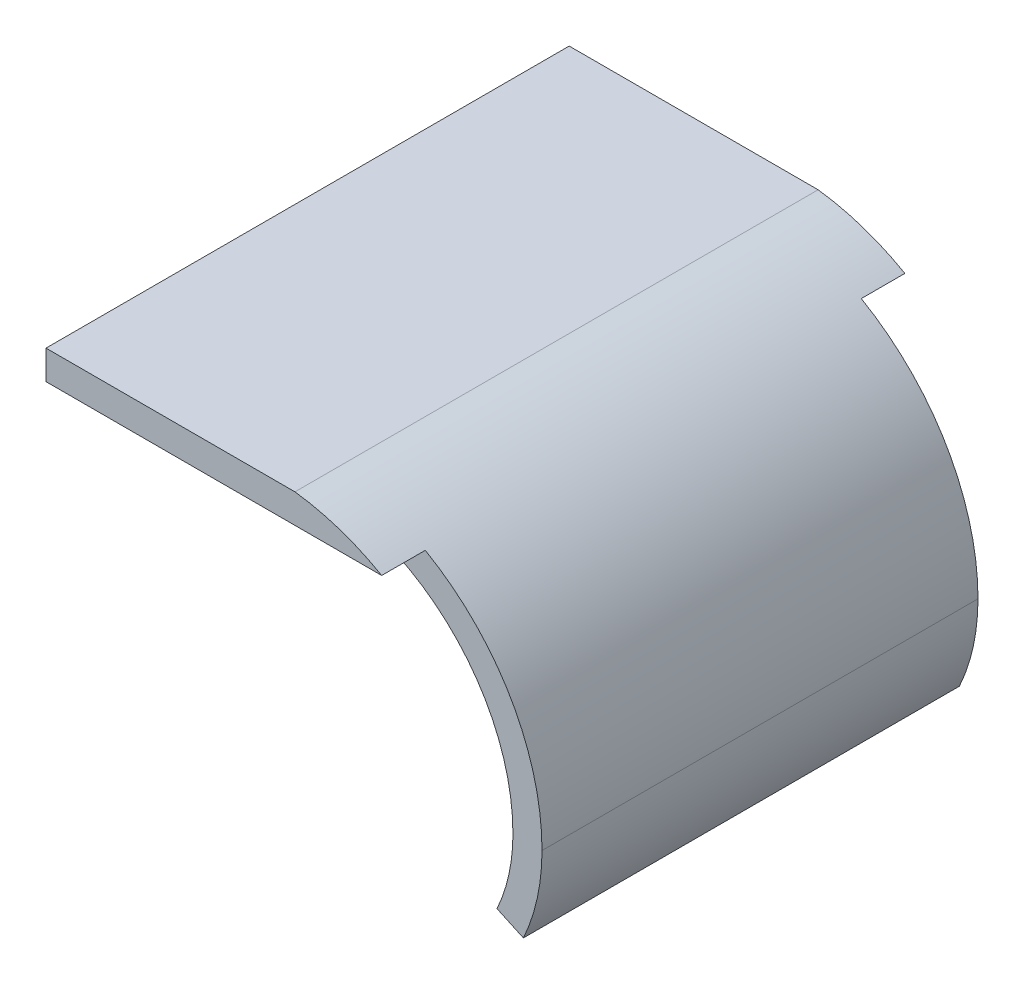
ISO-10303-21;
HEADER;
FILE_DESCRIPTION(('STEP AP214'),'2;1');
FILE_NAME('part.step','',(''),(''),'','','');
FILE_SCHEMA(('AUTOMOTIVE_DESIGN { 1 0 10303 214 1 1 1 1 }'));
ENDSEC;
DATA;
#1=APPLICATION_CONTEXT('core data for automotive mechanical design processes');
#2=APPLICATION_PROTOCOL_DEFINITION('international standard','automotive_design',2000,#1);
#3=PRODUCT_CONTEXT('',#1,'mechanical');
#4=PRODUCT('Part','Part','',(#3));
#5=PRODUCT_RELATED_PRODUCT_CATEGORY('part','',(#4));
#6=PRODUCT_DEFINITION_FORMATION('','',#4);
#7=PRODUCT_DEFINITION_CONTEXT('part definition',#1,'design');
#8=PRODUCT_DEFINITION('design','',#6,#7);
#9=PRODUCT_DEFINITION_SHAPE('','',#8);
#10=(LENGTH_UNIT() NAMED_UNIT(*) SI_UNIT(.MILLI.,.METRE.));
#11=(NAMED_UNIT(*) PLANE_ANGLE_UNIT() SI_UNIT($,.RADIAN.));
#12=(NAMED_UNIT(*) SI_UNIT($,.STERADIAN.) SOLID_ANGLE_UNIT());
#13=UNCERTAINTY_MEASURE_WITH_UNIT(LENGTH_MEASURE(1.E-05),#10,'distance_accuracy_value','');
#14=(GEOMETRIC_REPRESENTATION_CONTEXT(3) GLOBAL_UNCERTAINTY_ASSIGNED_CONTEXT((#13)) GLOBAL_UNIT_ASSIGNED_CONTEXT((#10,
#11,#12)) REPRESENTATION_CONTEXT('',''));
#15=CARTESIAN_POINT('',(0.,0.,0.));
#16=DIRECTION('',(0.,0.,1.));
#17=DIRECTION('',(1.,0.,0.));
#18=AXIS2_PLACEMENT_3D('',#15,#16,#17);
#19=CARTESIAN_POINT('',(-1.,0.,9.));
#20=DIRECTION('',(0.,0.,-1.));
#21=DIRECTION('',(-1.,0.,0.));
#22=AXIS2_PLACEMENT_3D('',#19,#20,#21);
#23=CYLINDRICAL_SURFACE('',#22,7.);
#24=CARTESIAN_POINT('',(-1.,0.,-7.5));
#25=DIRECTION('',(0.,0.,-1.));
#26=DIRECTION('',(1.,0.,0.));
#27=AXIS2_PLACEMENT_3D('',#24,#25,#26);
#28=CIRCLE('',#27,7.);
#29=CARTESIAN_POINT('',(-0.0648487467860949,6.93725393319377,-7.5));
#30=VERTEX_POINT('',#29);
#31=CARTESIAN_POINT('',(6.,0.,-7.5));
#32=VERTEX_POINT('',#31);
#33=EDGE_CURVE('E132',#30,#32,#28,.T.);
#34=ORIENTED_EDGE('',*,*,#33,.T.);
#35=DIRECTION('',(0.,0.,-1.));
#36=VECTOR('',#35,1.);
#37=CARTESIAN_POINT('',(6.,0.,9.));
#38=LINE('',#37,#36);
#39=CARTESIAN_POINT('',(6.,0.,7.5));
#40=VERTEX_POINT('',#39);
#41=EDGE_CURVE('E145',#40,#32,#38,.T.);
#42=ORIENTED_EDGE('',*,*,#41,.F.);
#43=CARTESIAN_POINT('',(-1.,0.,7.5));
#44=DIRECTION('',(0.,0.,-1.));
#45=DIRECTION('',(1.,0.,0.));
#46=AXIS2_PLACEMENT_3D('',#43,#44,#45);
#47=CIRCLE('',#46,7.);
#48=CARTESIAN_POINT('',(-0.0648487467860949,6.93725393319377,7.5));
#49=VERTEX_POINT('',#48);
#50=EDGE_CURVE('E199',#49,#40,#47,.T.);
#51=ORIENTED_EDGE('',*,*,#50,.F.);
#52=DIRECTION('',(0.,0.,-1.));
#53=VECTOR('',#52,1.);
#54=CARTESIAN_POINT('',(-0.0648487467860949,6.93725393319377,9.));
#55=LINE('',#54,#53);
#56=EDGE_CURVE('E54',#49,#30,#55,.T.);
#57=ORIENTED_EDGE('',*,*,#56,.T.);
#58=EDGE_LOOP('',(#34,#42,#51,#57));
#59=FACE_BOUND('',#58,.T.);
#60=ADVANCED_FACE('F45',(#59),#23,.F.);
#61=CARTESIAN_POINT('',(0.,0.,9.));
#62=DIRECTION('',(0.,0.,-1.));
#63=DIRECTION('',(-1.,0.,0.));
#64=AXIS2_PLACEMENT_3D('',#61,#62,#63);
#65=CYLINDRICAL_SURFACE('',#64,6.);
#66=CARTESIAN_POINT('',(0.,0.,-7.5));
#67=DIRECTION('',(0.,0.,-1.));
#68=DIRECTION('',(1.,0.,0.));
#69=AXIS2_PLACEMENT_3D('',#66,#67,#68);
#70=CIRCLE('',#69,6.);
#71=CARTESIAN_POINT('',(5.45107468434266,-2.50714674195957,-7.5));
#72=VERTEX_POINT('',#71);
#73=EDGE_CURVE('E128',#32,#72,#70,.T.);
#74=ORIENTED_EDGE('',*,*,#73,.T.);
#75=DIRECTION('',(0.,0.,-1.));
#76=VECTOR('',#75,1.);
#77=CARTESIAN_POINT('',(5.45107468434266,-2.50714674195957,9.));
#78=LINE('',#77,#76);
#79=CARTESIAN_POINT('',(5.45107468434266,-2.50714674195957,7.5));
#80=VERTEX_POINT('',#79);
#81=EDGE_CURVE('E154',#80,#72,#78,.T.);
#82=ORIENTED_EDGE('',*,*,#81,.F.);
#83=CARTESIAN_POINT('',(0.,0.,7.5));
#84=DIRECTION('',(0.,0.,-1.));
#85=DIRECTION('',(1.,0.,0.));
#86=AXIS2_PLACEMENT_3D('',#83,#84,#85);
#87=CIRCLE('',#86,6.);
#88=EDGE_CURVE('E152',#40,#80,#87,.T.);
#89=ORIENTED_EDGE('',*,*,#88,.F.);
#90=ORIENTED_EDGE('',*,*,#41,.T.);
#91=EDGE_LOOP('',(#74,#82,#89,#90));
#92=FACE_BOUND('',#91,.T.);
#93=ADVANCED_FACE('F151',(#92),#65,.F.);
#94=CARTESIAN_POINT('',(5.45107468434266,-2.50714674195958,9.));
#95=DIRECTION('',(0.417857790326596,0.908512447390444,0.));
#96=DIRECTION('',(-0.908512447390444,0.417857790326596,0.));
#97=AXIS2_PLACEMENT_3D('',#94,#95,#96);
#98=PLANE('',#97);
#99=DIRECTION('',(0.908512447390444,-0.417857790326597,0.));
#100=VECTOR('',#99,1.);
#101=CARTESIAN_POINT('',(5.45107468434266,-2.50714674195957,-7.5));
#102=LINE('',#101,#100);
#103=CARTESIAN_POINT('',(6.35958713173311,-2.92500453228617,-7.5));
#104=VERTEX_POINT('',#103);
#105=EDGE_CURVE('E135',#72,#104,#102,.T.);
#106=ORIENTED_EDGE('',*,*,#105,.T.);
#107=DIRECTION('',(0.,0.,-1.));
#108=VECTOR('',#107,1.);
#109=CARTESIAN_POINT('',(6.35958713173311,-2.92500453228617,9.));
#110=LINE('',#109,#108);
#111=CARTESIAN_POINT('',(6.35958713173311,-2.92500453228617,7.5));
#112=VERTEX_POINT('',#111);
#113=EDGE_CURVE('E158',#112,#104,#110,.T.);
#114=ORIENTED_EDGE('',*,*,#113,.F.);
#115=DIRECTION('',(0.908512447390444,-0.417857790326597,0.));
#116=VECTOR('',#115,1.);
#117=CARTESIAN_POINT('',(5.45107468434266,-2.50714674195957,7.5));
#118=LINE('',#117,#116);
#119=EDGE_CURVE('E212',#80,#112,#118,.T.);
#120=ORIENTED_EDGE('',*,*,#119,.F.);
#121=ORIENTED_EDGE('',*,*,#81,.T.);
#122=EDGE_LOOP('',(#106,#114,#120,#121));
#123=FACE_BOUND('',#122,.T.);
#124=ADVANCED_FACE('F244',(#123),#98,.F.);
#125=CARTESIAN_POINT('',(0.,0.,9.));
#126=DIRECTION('',(0.,0.,-1.));
#127=DIRECTION('',(-1.,0.,0.));
#128=AXIS2_PLACEMENT_3D('',#125,#126,#127);
#129=CYLINDRICAL_SURFACE('',#128,7.);
#130=CARTESIAN_POINT('',(0.,0.,-7.5));
#131=DIRECTION('',(0.,0.,1.));
#132=DIRECTION('',(1.,0.,0.));
#133=AXIS2_PLACEMENT_3D('',#130,#131,#132);
#134=CIRCLE('',#133,7.);
#135=CARTESIAN_POINT('',(7.,0.,-7.5));
#136=VERTEX_POINT('',#135);
#137=EDGE_CURVE('E223',#104,#136,#134,.T.);
#138=ORIENTED_EDGE('',*,*,#137,.T.);
#139=DIRECTION('',(0.,0.,-1.));
#140=VECTOR('',#139,1.);
#141=CARTESIAN_POINT('',(7.,0.,9.));
#142=LINE('',#141,#140);
#143=CARTESIAN_POINT('',(7.,0.,7.5));
#144=VERTEX_POINT('',#143);
#145=EDGE_CURVE('E164',#144,#136,#142,.T.);
#146=ORIENTED_EDGE('',*,*,#145,.F.);
#147=CARTESIAN_POINT('',(0.,0.,7.5));
#148=DIRECTION('',(0.,0.,1.));
#149=DIRECTION('',(1.,0.,0.));
#150=AXIS2_PLACEMENT_3D('',#147,#148,#149);
#151=CIRCLE('',#150,7.);
#152=EDGE_CURVE('E209',#112,#144,#151,.T.);
#153=ORIENTED_EDGE('',*,*,#152,.F.);
#154=ORIENTED_EDGE('',*,*,#113,.T.);
#155=EDGE_LOOP('',(#138,#146,#153,#154));
#156=FACE_BOUND('',#155,.T.);
#157=ADVANCED_FACE('F241',(#156),#129,.T.);
#158=CARTESIAN_POINT('',(-1.,0.,9.));
#159=DIRECTION('',(0.,0.,-1.));
#160=DIRECTION('',(-1.,0.,0.));
#161=AXIS2_PLACEMENT_3D('',#158,#159,#160);
#162=CYLINDRICAL_SURFACE('',#161,8.);
#163=DIRECTION('',(0.,0.,-1.));
#164=VECTOR('',#163,1.);
#165=CARTESIAN_POINT('',(2.98428260373025,6.93725393319377,-7.5));
#166=LINE('',#165,#164);
#167=CARTESIAN_POINT('',(2.98428260373025,6.93725393319377,-7.5));
#168=VERTEX_POINT('',#167);
#169=CARTESIAN_POINT('',(2.98428260373025,6.93725393319377,-9.));
#170=VERTEX_POINT('',#169);
#171=EDGE_CURVE('E217',#168,#170,#166,.T.);
#172=ORIENTED_EDGE('',*,*,#171,.T.);
#173=CARTESIAN_POINT('',(-1.,0.,-9.));
#174=DIRECTION('',(0.,0.,1.));
#175=DIRECTION('',(1.,0.,0.));
#176=AXIS2_PLACEMENT_3D('',#173,#174,#175);
#177=CIRCLE('',#176,8.);
#178=CARTESIAN_POINT('',(0.,7.93725393319377,-9.));
#179=VERTEX_POINT('',#178);
#180=EDGE_CURVE('E177',#170,#179,#177,.T.);
#181=ORIENTED_EDGE('',*,*,#180,.T.);
#182=DIRECTION('',(0.,0.,-1.));
#183=VECTOR('',#182,1.);
#184=CARTESIAN_POINT('',(0.,7.93725393319377,9.));
#185=LINE('',#184,#183);
#186=CARTESIAN_POINT('',(0.,7.93725393319377,9.));
#187=VERTEX_POINT('',#186);
#188=EDGE_CURVE('E168',#187,#179,#185,.T.);
#189=ORIENTED_EDGE('',*,*,#188,.F.);
#190=CARTESIAN_POINT('',(-1.,0.,9.));
#191=DIRECTION('',(0.,0.,1.));
#192=DIRECTION('',(1.,0.,0.));
#193=AXIS2_PLACEMENT_3D('',#190,#191,#192);
#194=CIRCLE('',#193,8.);
#195=CARTESIAN_POINT('',(2.98428260373025,6.93725393319377,9.));
#196=VERTEX_POINT('',#195);
#197=EDGE_CURVE('E190',#196,#187,#194,.T.);
#198=ORIENTED_EDGE('',*,*,#197,.F.);
#199=DIRECTION('',(0.,0.,1.));
#200=VECTOR('',#199,1.);
#201=CARTESIAN_POINT('',(2.98428260373025,6.93725393319377,7.5));
#202=LINE('',#201,#200);
#203=CARTESIAN_POINT('',(2.98428260373025,6.93725393319377,7.5));
#204=VERTEX_POINT('',#203);
#205=EDGE_CURVE('E187',#204,#196,#202,.T.);
#206=ORIENTED_EDGE('',*,*,#205,.F.);
#207=CARTESIAN_POINT('',(-1.,0.,7.5));
#208=DIRECTION('',(0.,0.,1.));
#209=DIRECTION('',(1.,0.,0.));
#210=AXIS2_PLACEMENT_3D('',#207,#208,#209);
#211=CIRCLE('',#210,8.);
#212=EDGE_CURVE('E205',#144,#204,#211,.T.);
#213=ORIENTED_EDGE('',*,*,#212,.F.);
#214=ORIENTED_EDGE('',*,*,#145,.T.);
#215=CARTESIAN_POINT('',(-1.,0.,-7.5));
#216=DIRECTION('',(0.,0.,1.));
#217=DIRECTION('',(1.,0.,0.));
#218=AXIS2_PLACEMENT_3D('',#215,#216,#217);
#219=CIRCLE('',#218,8.);
#220=EDGE_CURVE('E227',#136,#168,#219,.T.);
#221=ORIENTED_EDGE('',*,*,#220,.T.);
#222=EDGE_LOOP('',(#172,#181,#189,#198,#206,#213,#214,#221));
#223=FACE_BOUND('',#222,.T.);
#224=ADVANCED_FACE('F234',(#223),#162,.T.);
#225=CARTESIAN_POINT('',(-1.,0.,-9.));
#226=DIRECTION('',(0.,0.,1.));
#227=DIRECTION('',(1.,0.,0.));
#228=AXIS2_PLACEMENT_3D('',#225,#226,#227);
#229=PLANE('',#228);
#230=ORIENTED_EDGE('',*,*,#180,.F.);
#231=DIRECTION('',(1.,0.,0.));
#232=VECTOR('',#231,1.);
#233=CARTESIAN_POINT('',(-0.0648487467860949,6.93725393319377,-9.));
#234=LINE('',#233,#232);
#235=CARTESIAN_POINT('',(-8.56484874678609,6.93725393319377,-9.));
#236=VERTEX_POINT('',#235);
#237=EDGE_CURVE('E180',#236,#170,#234,.T.);
#238=ORIENTED_EDGE('',*,*,#237,.F.);
#239=DIRECTION('',(0.,-1.,0.));
#240=VECTOR('',#239,1.);
#241=CARTESIAN_POINT('',(-8.56484874678609,7.93725393319377,-9.));
#242=LINE('',#241,#240);
#243=CARTESIAN_POINT('',(-8.56484874678609,7.93725393319377,-9.));
#244=VERTEX_POINT('',#243);
#245=EDGE_CURVE('E183',#244,#236,#242,.T.);
#246=ORIENTED_EDGE('',*,*,#245,.F.);
#247=DIRECTION('',(-1.,0.,0.));
#248=VECTOR('',#247,1.);
#249=CARTESIAN_POINT('',(0.,7.93725393319377,-9.));
#250=LINE('',#249,#248);
#251=EDGE_CURVE('E84',#179,#244,#250,.T.);
#252=ORIENTED_EDGE('',*,*,#251,.F.);
#253=EDGE_LOOP('',(#230,#238,#246,#252));
#254=FACE_BOUND('',#253,.T.);
#255=ADVANCED_FACE('F274',(#254),#229,.F.);
#256=CARTESIAN_POINT('',(-8.56484874678609,7.93725393319377,9.));
#257=DIRECTION('',(1.,0.,0.));
#258=DIRECTION('',(0.,0.,-1.));
#259=AXIS2_PLACEMENT_3D('',#256,#257,#258);
#260=PLANE('',#259);
#261=ORIENTED_EDGE('',*,*,#245,.T.);
#262=DIRECTION('',(0.,0.,-1.));
#263=VECTOR('',#262,1.);
#264=CARTESIAN_POINT('',(-8.56484874678609,6.93725393319377,9.));
#265=LINE('',#264,#263);
#266=CARTESIAN_POINT('',(-8.56484874678609,6.93725393319377,9.));
#267=VERTEX_POINT('',#266);
#268=EDGE_CURVE('E11',#267,#236,#265,.T.);
#269=ORIENTED_EDGE('',*,*,#268,.F.);
#270=DIRECTION('',(0.,-1.,0.));
#271=VECTOR('',#270,1.);
#272=CARTESIAN_POINT('',(-8.56484874678609,7.93725393319377,9.));
#273=LINE('',#272,#271);
#274=CARTESIAN_POINT('',(-8.56484874678609,7.93725393319377,9.));
#275=VERTEX_POINT('',#274);
#276=EDGE_CURVE('E176',#275,#267,#273,.T.);
#277=ORIENTED_EDGE('',*,*,#276,.F.);
#278=DIRECTION('',(0.,0.,-1.));
#279=VECTOR('',#278,1.);
#280=CARTESIAN_POINT('',(-8.56484874678609,7.93725393319377,9.));
#281=LINE('',#280,#279);
#282=EDGE_CURVE('E171',#275,#244,#281,.T.);
#283=ORIENTED_EDGE('',*,*,#282,.T.);
#284=EDGE_LOOP('',(#261,#269,#277,#283));
#285=FACE_BOUND('',#284,.T.);
#286=ADVANCED_FACE('F47',(#285),#260,.F.);
#287=CARTESIAN_POINT('',(-0.0648487467860949,6.93725393319377,9.));
#288=DIRECTION('',(0.,1.,0.));
#289=DIRECTION('',(-1.,0.,0.));
#290=AXIS2_PLACEMENT_3D('',#287,#288,#289);
#291=PLANE('',#290);
#292=ORIENTED_EDGE('',*,*,#237,.T.);
#293=ORIENTED_EDGE('',*,*,#171,.F.);
#294=DIRECTION('',(-1.,0.,0.));
#295=VECTOR('',#294,1.);
#296=CARTESIAN_POINT('',(-0.0648487467860949,6.93725393319377,-7.5));
#297=LINE('',#296,#295);
#298=EDGE_CURVE('E148',#168,#30,#297,.T.);
#299=ORIENTED_EDGE('',*,*,#298,.T.);
#300=ORIENTED_EDGE('',*,*,#56,.F.);
#301=DIRECTION('',(-1.,0.,0.));
#302=VECTOR('',#301,1.);
#303=CARTESIAN_POINT('',(-0.0648487467860949,6.93725393319377,7.5));
#304=LINE('',#303,#302);
#305=EDGE_CURVE('E202',#204,#49,#304,.T.);
#306=ORIENTED_EDGE('',*,*,#305,.F.);
#307=ORIENTED_EDGE('',*,*,#205,.T.);
#308=DIRECTION('',(1.,0.,0.));
#309=VECTOR('',#308,1.);
#310=CARTESIAN_POINT('',(-0.0648487467860949,6.93725393319377,9.));
#311=LINE('',#310,#309);
#312=EDGE_CURVE('E61',#267,#196,#311,.T.);
#313=ORIENTED_EDGE('',*,*,#312,.F.);
#314=ORIENTED_EDGE('',*,*,#268,.T.);
#315=EDGE_LOOP('',(#292,#293,#299,#300,#306,#307,#313,#314));
#316=FACE_BOUND('',#315,.T.);
#317=ADVANCED_FACE('F232',(#316),#291,.F.);
#318=CARTESIAN_POINT('',(0.,7.93725393319377,9.));
#319=DIRECTION('',(0.,-1.,0.));
#320=DIRECTION('',(1.,0.,0.));
#321=AXIS2_PLACEMENT_3D('',#318,#319,#320);
#322=PLANE('',#321);
#323=ORIENTED_EDGE('',*,*,#251,.T.);
#324=ORIENTED_EDGE('',*,*,#282,.F.);
#325=DIRECTION('',(-1.,0.,0.));
#326=VECTOR('',#325,1.);
#327=CARTESIAN_POINT('',(0.,7.93725393319377,9.));
#328=LINE('',#327,#326);
#329=EDGE_CURVE('E67',#187,#275,#328,.T.);
#330=ORIENTED_EDGE('',*,*,#329,.F.);
#331=ORIENTED_EDGE('',*,*,#188,.T.);
#332=EDGE_LOOP('',(#323,#324,#330,#331));
#333=FACE_BOUND('',#332,.T.);
#334=ADVANCED_FACE('F252',(#333),#322,.F.);
#335=CARTESIAN_POINT('',(-1.,0.,9.));
#336=DIRECTION('',(0.,0.,1.));
#337=DIRECTION('',(1.,0.,0.));
#338=AXIS2_PLACEMENT_3D('',#335,#336,#337);
#339=PLANE('',#338);
#340=ORIENTED_EDGE('',*,*,#312,.T.);
#341=ORIENTED_EDGE('',*,*,#197,.T.);
#342=ORIENTED_EDGE('',*,*,#329,.T.);
#343=ORIENTED_EDGE('',*,*,#276,.T.);
#344=EDGE_LOOP('',(#340,#341,#342,#343));
#345=FACE_BOUND('',#344,.T.);
#346=ADVANCED_FACE('F250',(#345),#339,.T.);
#347=CARTESIAN_POINT('',(0.,0.,7.5));
#348=DIRECTION('',(0.,0.,1.));
#349=DIRECTION('',(1.,0.,0.));
#350=AXIS2_PLACEMENT_3D('',#347,#348,#349);
#351=PLANE('',#350);
#352=ORIENTED_EDGE('',*,*,#88,.T.);
#353=ORIENTED_EDGE('',*,*,#119,.T.);
#354=ORIENTED_EDGE('',*,*,#152,.T.);
#355=ORIENTED_EDGE('',*,*,#212,.T.);
#356=ORIENTED_EDGE('',*,*,#305,.T.);
#357=ORIENTED_EDGE('',*,*,#50,.T.);
#358=EDGE_LOOP('',(#352,#353,#354,#355,#356,#357));
#359=FACE_BOUND('',#358,.T.);
#360=ADVANCED_FACE('F247',(#359),#351,.T.);
#361=CARTESIAN_POINT('',(0.,0.,-7.5));
#362=DIRECTION('',(0.,0.,-1.));
#363=DIRECTION('',(1.,0.,0.));
#364=AXIS2_PLACEMENT_3D('',#361,#362,#363);
#365=PLANE('',#364);
#366=ORIENTED_EDGE('',*,*,#73,.F.);
#367=ORIENTED_EDGE('',*,*,#33,.F.);
#368=ORIENTED_EDGE('',*,*,#298,.F.);
#369=ORIENTED_EDGE('',*,*,#220,.F.);
#370=ORIENTED_EDGE('',*,*,#137,.F.);
#371=ORIENTED_EDGE('',*,*,#105,.F.);
#372=EDGE_LOOP('',(#366,#367,#368,#369,#370,#371));
#373=FACE_BOUND('',#372,.T.);
#374=ADVANCED_FACE('F130',(#373),#365,.T.);
#375=CLOSED_SHELL('',(#60,#93,#124,#157,#224,#255,#286,#317,#334,#346,#360,#374));
#376=MANIFOLD_SOLID_BREP('B2',#375);
#377=ADVANCED_BREP_SHAPE_REPRESENTATION('',(#18,#376),#14);
#378=SHAPE_DEFINITION_REPRESENTATION(#9,#377);
ENDSEC;
END-ISO-10303-21;
